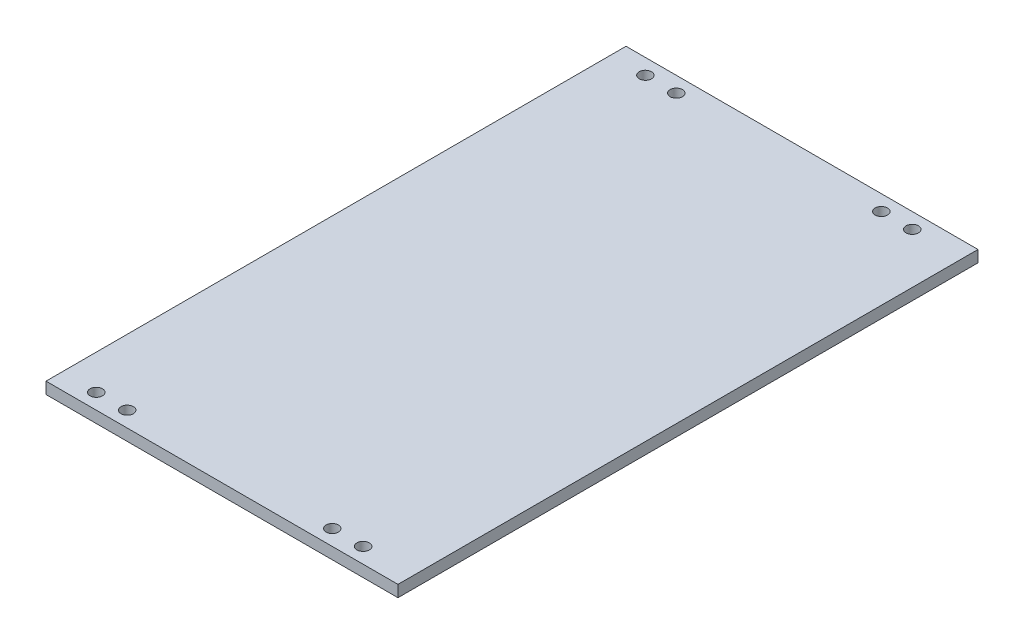
ISO-10303-21;
HEADER;
FILE_DESCRIPTION(('STEP AP214'),'2;1');
FILE_NAME('part.step','',(''),(''),'','','');
FILE_SCHEMA(('AUTOMOTIVE_DESIGN { 1 0 10303 214 1 1 1 1 }'));
ENDSEC;
DATA;
#1=APPLICATION_CONTEXT('core data for automotive mechanical design processes');
#2=APPLICATION_PROTOCOL_DEFINITION('international standard','automotive_design',2000,#1);
#3=PRODUCT_CONTEXT('',#1,'mechanical');
#4=PRODUCT('Part','Part','',(#3));
#5=PRODUCT_RELATED_PRODUCT_CATEGORY('part','',(#4));
#6=PRODUCT_DEFINITION_FORMATION('','',#4);
#7=PRODUCT_DEFINITION_CONTEXT('part definition',#1,'design');
#8=PRODUCT_DEFINITION('design','',#6,#7);
#9=PRODUCT_DEFINITION_SHAPE('','',#8);
#10=(LENGTH_UNIT() NAMED_UNIT(*) SI_UNIT(.MILLI.,.METRE.));
#11=(NAMED_UNIT(*) PLANE_ANGLE_UNIT() SI_UNIT($,.RADIAN.));
#12=(NAMED_UNIT(*) SI_UNIT($,.STERADIAN.) SOLID_ANGLE_UNIT());
#13=UNCERTAINTY_MEASURE_WITH_UNIT(LENGTH_MEASURE(1.E-05),#10,'distance_accuracy_value','');
#14=(GEOMETRIC_REPRESENTATION_CONTEXT(3) GLOBAL_UNCERTAINTY_ASSIGNED_CONTEXT((#13)) GLOBAL_UNIT_ASSIGNED_CONTEXT((#10,
#11,#12)) REPRESENTATION_CONTEXT('',''));
#15=CARTESIAN_POINT('',(0.,0.,0.));
#16=DIRECTION('',(0.,0.,1.));
#17=DIRECTION('',(1.,0.,0.));
#18=AXIS2_PLACEMENT_3D('',#15,#16,#17);
#19=CARTESIAN_POINT('',(65.2049606735181,5.25915524788277,-47.1117165948132));
#20=DIRECTION('',(1.,0.,0.));
#21=DIRECTION('',(0.,0.,-1.));
#22=AXIS2_PLACEMENT_3D('',#19,#20,#21);
#23=PLANE('',#22);
#24=DIRECTION('',(0.,0.,1.));
#25=VECTOR('',#24,1.);
#26=CARTESIAN_POINT('',(65.2049606735181,2.25915524788277,-47.1117165948132));
#27=LINE('',#26,#25);
#28=CARTESIAN_POINT('',(65.2049606735181,2.25915524788277,-47.1117165948132));
#29=VERTEX_POINT('',#28);
#30=CARTESIAN_POINT('',(65.2049606735181,2.25915524788277,102.888283405187));
#31=VERTEX_POINT('',#30);
#32=EDGE_CURVE('E119',#29,#31,#27,.T.);
#33=ORIENTED_EDGE('',*,*,#32,.F.);
#34=DIRECTION('',(0.,-1.,0.));
#35=VECTOR('',#34,1.);
#36=CARTESIAN_POINT('',(65.2049606735181,5.25915524788277,-47.1117165948132));
#37=LINE('',#36,#35);
#38=CARTESIAN_POINT('',(65.2049606735181,5.25915524788277,-47.1117165948132));
#39=VERTEX_POINT('',#38);
#40=EDGE_CURVE('E11',#39,#29,#37,.T.);
#41=ORIENTED_EDGE('',*,*,#40,.F.);
#42=DIRECTION('',(0.,0.,1.));
#43=VECTOR('',#42,1.);
#44=CARTESIAN_POINT('',(65.2049606735181,5.25915524788277,-47.1117165948132));
#45=LINE('',#44,#43);
#46=CARTESIAN_POINT('',(65.2049606735181,5.25915524788277,102.888283405187));
#47=VERTEX_POINT('',#46);
#48=EDGE_CURVE('E109',#39,#47,#45,.T.);
#49=ORIENTED_EDGE('',*,*,#48,.T.);
#50=DIRECTION('',(0.,-1.,0.));
#51=VECTOR('',#50,1.);
#52=CARTESIAN_POINT('',(65.2049606735181,5.25915524788277,102.888283405187));
#53=LINE('',#52,#51);
#54=EDGE_CURVE('E50',#47,#31,#53,.T.);
#55=ORIENTED_EDGE('',*,*,#54,.T.);
#56=EDGE_LOOP('',(#33,#41,#49,#55));
#57=FACE_BOUND('',#56,.T.);
#58=ADVANCED_FACE('F47',(#57),#23,.T.);
#59=CARTESIAN_POINT('',(65.2049606735181,5.25915524788277,-47.1117165948132));
#60=DIRECTION('',(0.,0.,-1.));
#61=DIRECTION('',(-1.,0.,0.));
#62=AXIS2_PLACEMENT_3D('',#59,#60,#61);
#63=PLANE('',#62);
#64=DIRECTION('',(1.,0.,0.));
#65=VECTOR('',#64,1.);
#66=CARTESIAN_POINT('',(65.2049606735181,2.25915524788277,-47.1117165948132));
#67=LINE('',#66,#65);
#68=CARTESIAN_POINT('',(-25.8155102632688,2.25915524788277,-47.1117165948132));
#69=VERTEX_POINT('',#68);
#70=EDGE_CURVE('E113',#69,#29,#67,.T.);
#71=ORIENTED_EDGE('',*,*,#70,.F.);
#72=DIRECTION('',(0.,-1.,0.));
#73=VECTOR('',#72,1.);
#74=CARTESIAN_POINT('',(-25.8155102632688,5.25915524788277,-47.1117165948132));
#75=LINE('',#74,#73);
#76=CARTESIAN_POINT('',(-25.8155102632688,5.25915524788277,-47.1117165948132));
#77=VERTEX_POINT('',#76);
#78=EDGE_CURVE('E57',#77,#69,#75,.T.);
#79=ORIENTED_EDGE('',*,*,#78,.F.);
#80=DIRECTION('',(1.,0.,0.));
#81=VECTOR('',#80,1.);
#82=CARTESIAN_POINT('',(65.2049606735181,5.25915524788277,-47.1117165948132));
#83=LINE('',#82,#81);
#84=EDGE_CURVE('E104',#77,#39,#83,.T.);
#85=ORIENTED_EDGE('',*,*,#84,.T.);
#86=ORIENTED_EDGE('',*,*,#40,.T.);
#87=EDGE_LOOP('',(#71,#79,#85,#86));
#88=FACE_BOUND('',#87,.T.);
#89=ADVANCED_FACE('F142',(#88),#63,.T.);
#90=CARTESIAN_POINT('',(-25.8155102632688,5.25915524788277,-47.1117165948132));
#91=DIRECTION('',(-1.,0.,0.));
#92=DIRECTION('',(0.,0.,1.));
#93=AXIS2_PLACEMENT_3D('',#90,#91,#92);
#94=PLANE('',#93);
#95=DIRECTION('',(0.,0.,-1.));
#96=VECTOR('',#95,1.);
#97=CARTESIAN_POINT('',(-25.8155102632688,2.25915524788277,-47.1117165948132));
#98=LINE('',#97,#96);
#99=CARTESIAN_POINT('',(-25.8155102632689,2.25915524788277,102.888283405187));
#100=VERTEX_POINT('',#99);
#101=EDGE_CURVE('E98',#100,#69,#98,.T.);
#102=ORIENTED_EDGE('',*,*,#101,.F.);
#103=DIRECTION('',(0.,-1.,0.));
#104=VECTOR('',#103,1.);
#105=CARTESIAN_POINT('',(-25.8155102632689,5.25915524788277,102.888283405187));
#106=LINE('',#105,#104);
#107=CARTESIAN_POINT('',(-25.8155102632689,5.25915524788277,102.888283405187));
#108=VERTEX_POINT('',#107);
#109=EDGE_CURVE('E93',#108,#100,#106,.T.);
#110=ORIENTED_EDGE('',*,*,#109,.F.);
#111=DIRECTION('',(0.,0.,-1.));
#112=VECTOR('',#111,1.);
#113=CARTESIAN_POINT('',(-25.8155102632688,5.25915524788277,-47.1117165948132));
#114=LINE('',#113,#112);
#115=EDGE_CURVE('E96',#108,#77,#114,.T.);
#116=ORIENTED_EDGE('',*,*,#115,.T.);
#117=ORIENTED_EDGE('',*,*,#78,.T.);
#118=EDGE_LOOP('',(#102,#110,#116,#117));
#119=FACE_BOUND('',#118,.T.);
#120=ADVANCED_FACE('F95',(#119),#94,.T.);
#121=CARTESIAN_POINT('',(65.2049606735181,5.25915524788277,102.888283405187));
#122=DIRECTION('',(0.,0.,1.));
#123=DIRECTION('',(1.,0.,0.));
#124=AXIS2_PLACEMENT_3D('',#121,#122,#123);
#125=PLANE('',#124);
#126=DIRECTION('',(-1.,0.,0.));
#127=VECTOR('',#126,1.);
#128=CARTESIAN_POINT('',(65.2049606735181,2.25915524788277,102.888283405187));
#129=LINE('',#128,#127);
#130=EDGE_CURVE('E123',#31,#100,#129,.T.);
#131=ORIENTED_EDGE('',*,*,#130,.F.);
#132=ORIENTED_EDGE('',*,*,#54,.F.);
#133=DIRECTION('',(-1.,0.,0.));
#134=VECTOR('',#133,1.);
#135=CARTESIAN_POINT('',(65.2049606735181,5.25915524788277,102.888283405187));
#136=LINE('',#135,#134);
#137=EDGE_CURVE('E103',#47,#108,#136,.T.);
#138=ORIENTED_EDGE('',*,*,#137,.T.);
#139=ORIENTED_EDGE('',*,*,#109,.T.);
#140=EDGE_LOOP('',(#131,#132,#138,#139));
#141=FACE_BOUND('',#140,.T.);
#142=ADVANCED_FACE('F107',(#141),#125,.T.);
#143=CARTESIAN_POINT('',(0.,5.25915524788277,0.));
#144=DIRECTION('',(0.,-1.,0.));
#145=DIRECTION('',(0.,0.,-1.));
#146=AXIS2_PLACEMENT_3D('',#143,#144,#145);
#147=PLANE('',#146);
#148=CARTESIAN_POINT('',(-16.8155102632688,5.25915524788277,98.8882834051867));
#149=DIRECTION('',(0.,-1.,0.));
#150=DIRECTION('',(0.,0.,1.));
#151=AXIS2_PLACEMENT_3D('',#148,#149,#150);
#152=CIRCLE('',#151,1.59999999999999);
#153=CARTESIAN_POINT('',(-16.8155102632688,5.25915524788277,100.488283405187));
#154=VERTEX_POINT('',#153);
#155=EDGE_CURVE('E199',#154,#154,#152,.T.);
#156=ORIENTED_EDGE('',*,*,#155,.T.);
#157=EDGE_LOOP('',(#156));
#158=FACE_BOUND('',#157,.T.);
#159=CARTESIAN_POINT('',(-8.81551026326879,5.25915524788277,98.8882834051867));
#160=DIRECTION('',(0.,-1.,0.));
#161=DIRECTION('',(0.,0.,1.));
#162=AXIS2_PLACEMENT_3D('',#159,#160,#161);
#163=CIRCLE('',#162,1.59999999999999);
#164=CARTESIAN_POINT('',(-8.81551026326879,5.25915524788277,100.488283405187));
#165=VERTEX_POINT('',#164);
#166=EDGE_CURVE('E210',#165,#165,#163,.T.);
#167=ORIENTED_EDGE('',*,*,#166,.T.);
#168=EDGE_LOOP('',(#167));
#169=FACE_BOUND('',#168,.T.);
#170=CARTESIAN_POINT('',(-8.81551026326885,5.25915524788277,-43.1117165948132));
#171=DIRECTION('',(0.,-1.,0.));
#172=DIRECTION('',(0.,0.,-1.));
#173=AXIS2_PLACEMENT_3D('',#170,#171,#172);
#174=CIRCLE('',#173,1.6);
#175=CARTESIAN_POINT('',(-8.81551026326885,5.25915524788277,-44.7117165948132));
#176=VERTEX_POINT('',#175);
#177=EDGE_CURVE('E218',#176,#176,#174,.T.);
#178=ORIENTED_EDGE('',*,*,#177,.T.);
#179=EDGE_LOOP('',(#178));
#180=FACE_BOUND('',#179,.T.);
#181=CARTESIAN_POINT('',(-16.8155102632688,5.25915524788277,-43.1117165948132));
#182=DIRECTION('',(0.,-1.,0.));
#183=DIRECTION('',(0.,0.,-1.));
#184=AXIS2_PLACEMENT_3D('',#181,#182,#183);
#185=CIRCLE('',#184,1.6);
#186=CARTESIAN_POINT('',(-16.8155102632688,5.25915524788277,-44.7117165948132));
#187=VERTEX_POINT('',#186);
#188=EDGE_CURVE('E226',#187,#187,#185,.T.);
#189=ORIENTED_EDGE('',*,*,#188,.T.);
#190=EDGE_LOOP('',(#189));
#191=FACE_BOUND('',#190,.T.);
#192=CARTESIAN_POINT('',(44.2049606735182,5.25915524788277,98.8882834051868));
#193=DIRECTION('',(0.,-1.,0.));
#194=DIRECTION('',(0.,0.,1.));
#195=AXIS2_PLACEMENT_3D('',#192,#193,#194);
#196=CIRCLE('',#195,1.60000000000001);
#197=CARTESIAN_POINT('',(44.2049606735182,5.25915524788277,100.488283405187));
#198=VERTEX_POINT('',#197);
#199=EDGE_CURVE('E234',#198,#198,#196,.T.);
#200=ORIENTED_EDGE('',*,*,#199,.T.);
#201=EDGE_LOOP('',(#200));
#202=FACE_BOUND('',#201,.T.);
#203=CARTESIAN_POINT('',(52.2049606735181,5.25915524788277,98.8882834051868));
#204=DIRECTION('',(0.,-1.,0.));
#205=DIRECTION('',(0.,0.,1.));
#206=AXIS2_PLACEMENT_3D('',#203,#204,#205);
#207=CIRCLE('',#206,1.60000000000001);
#208=CARTESIAN_POINT('',(52.2049606735181,5.25915524788277,100.488283405187));
#209=VERTEX_POINT('',#208);
#210=EDGE_CURVE('E242',#209,#209,#207,.T.);
#211=ORIENTED_EDGE('',*,*,#210,.T.);
#212=EDGE_LOOP('',(#211));
#213=FACE_BOUND('',#212,.T.);
#214=CARTESIAN_POINT('',(52.2049606735181,5.25915524788277,-43.1117165948132));
#215=DIRECTION('',(0.,-1.,0.));
#216=DIRECTION('',(0.,0.,-1.));
#217=AXIS2_PLACEMENT_3D('',#214,#215,#216);
#218=CIRCLE('',#217,1.60000000000001);
#219=CARTESIAN_POINT('',(52.2049606735181,5.25915524788277,-44.7117165948132));
#220=VERTEX_POINT('',#219);
#221=EDGE_CURVE('E250',#220,#220,#218,.T.);
#222=ORIENTED_EDGE('',*,*,#221,.T.);
#223=EDGE_LOOP('',(#222));
#224=FACE_BOUND('',#223,.T.);
#225=CARTESIAN_POINT('',(44.2049606735181,5.25915524788277,-43.1117165948132));
#226=DIRECTION('',(0.,-1.,0.));
#227=DIRECTION('',(0.,0.,-1.));
#228=AXIS2_PLACEMENT_3D('',#225,#226,#227);
#229=CIRCLE('',#228,1.60000000000001);
#230=CARTESIAN_POINT('',(44.2049606735181,5.25915524788277,-44.7117165948132));
#231=VERTEX_POINT('',#230);
#232=EDGE_CURVE('E124',#231,#231,#229,.T.);
#233=ORIENTED_EDGE('',*,*,#232,.T.);
#234=EDGE_LOOP('',(#233));
#235=FACE_BOUND('',#234,.T.);
#236=ORIENTED_EDGE('',*,*,#48,.F.);
#237=ORIENTED_EDGE('',*,*,#84,.F.);
#238=ORIENTED_EDGE('',*,*,#115,.F.);
#239=ORIENTED_EDGE('',*,*,#137,.F.);
#240=EDGE_LOOP('',(#236,#237,#238,#239));
#241=FACE_BOUND('',#240,.T.);
#242=ADVANCED_FACE('F102',(#158,#169,#180,#191,#202,#213,#224,#235,#241),#147,.F.);
#243=CARTESIAN_POINT('',(0.,2.25915524788277,0.));
#244=DIRECTION('',(0.,-1.,0.));
#245=DIRECTION('',(0.,0.,-1.));
#246=AXIS2_PLACEMENT_3D('',#243,#244,#245);
#247=PLANE('',#246);
#248=CARTESIAN_POINT('',(-16.8155102632688,2.25915524788277,98.8882834051867));
#249=DIRECTION('',(0.,-1.,0.));
#250=DIRECTION('',(0.,0.,1.));
#251=AXIS2_PLACEMENT_3D('',#248,#249,#250);
#252=CIRCLE('',#251,1.59999999999999);
#253=CARTESIAN_POINT('',(-16.8155102632688,2.25915524788277,100.488283405187));
#254=VERTEX_POINT('',#253);
#255=EDGE_CURVE('E202',#254,#254,#252,.T.);
#256=ORIENTED_EDGE('',*,*,#255,.F.);
#257=EDGE_LOOP('',(#256));
#258=FACE_BOUND('',#257,.T.);
#259=CARTESIAN_POINT('',(-8.81551026326879,2.25915524788277,98.8882834051867));
#260=DIRECTION('',(0.,-1.,0.));
#261=DIRECTION('',(0.,0.,1.));
#262=AXIS2_PLACEMENT_3D('',#259,#260,#261);
#263=CIRCLE('',#262,1.59999999999999);
#264=CARTESIAN_POINT('',(-8.81551026326879,2.25915524788277,100.488283405187));
#265=VERTEX_POINT('',#264);
#266=EDGE_CURVE('E207',#265,#265,#263,.T.);
#267=ORIENTED_EDGE('',*,*,#266,.F.);
#268=EDGE_LOOP('',(#267));
#269=FACE_BOUND('',#268,.T.);
#270=CARTESIAN_POINT('',(-8.81551026326885,2.25915524788277,-43.1117165948132));
#271=DIRECTION('',(0.,-1.,0.));
#272=DIRECTION('',(0.,0.,-1.));
#273=AXIS2_PLACEMENT_3D('',#270,#271,#272);
#274=CIRCLE('',#273,1.6);
#275=CARTESIAN_POINT('',(-8.81551026326885,2.25915524788277,-44.7117165948132));
#276=VERTEX_POINT('',#275);
#277=EDGE_CURVE('E214',#276,#276,#274,.T.);
#278=ORIENTED_EDGE('',*,*,#277,.F.);
#279=EDGE_LOOP('',(#278));
#280=FACE_BOUND('',#279,.T.);
#281=CARTESIAN_POINT('',(-16.8155102632688,2.25915524788277,-43.1117165948132));
#282=DIRECTION('',(0.,-1.,0.));
#283=DIRECTION('',(0.,0.,-1.));
#284=AXIS2_PLACEMENT_3D('',#281,#282,#283);
#285=CIRCLE('',#284,1.6);
#286=CARTESIAN_POINT('',(-16.8155102632688,2.25915524788277,-44.7117165948132));
#287=VERTEX_POINT('',#286);
#288=EDGE_CURVE('E222',#287,#287,#285,.T.);
#289=ORIENTED_EDGE('',*,*,#288,.F.);
#290=EDGE_LOOP('',(#289));
#291=FACE_BOUND('',#290,.T.);
#292=CARTESIAN_POINT('',(44.2049606735182,2.25915524788277,98.8882834051868));
#293=DIRECTION('',(0.,-1.,0.));
#294=DIRECTION('',(0.,0.,1.));
#295=AXIS2_PLACEMENT_3D('',#292,#293,#294);
#296=CIRCLE('',#295,1.60000000000001);
#297=CARTESIAN_POINT('',(44.2049606735182,2.25915524788277,100.488283405187));
#298=VERTEX_POINT('',#297);
#299=EDGE_CURVE('E230',#298,#298,#296,.T.);
#300=ORIENTED_EDGE('',*,*,#299,.F.);
#301=EDGE_LOOP('',(#300));
#302=FACE_BOUND('',#301,.T.);
#303=CARTESIAN_POINT('',(52.2049606735181,2.25915524788277,98.8882834051868));
#304=DIRECTION('',(0.,-1.,0.));
#305=DIRECTION('',(0.,0.,1.));
#306=AXIS2_PLACEMENT_3D('',#303,#304,#305);
#307=CIRCLE('',#306,1.60000000000001);
#308=CARTESIAN_POINT('',(52.2049606735181,2.25915524788277,100.488283405187));
#309=VERTEX_POINT('',#308);
#310=EDGE_CURVE('E238',#309,#309,#307,.T.);
#311=ORIENTED_EDGE('',*,*,#310,.F.);
#312=EDGE_LOOP('',(#311));
#313=FACE_BOUND('',#312,.T.);
#314=CARTESIAN_POINT('',(52.2049606735181,2.25915524788277,-43.1117165948132));
#315=DIRECTION('',(0.,-1.,0.));
#316=DIRECTION('',(0.,0.,-1.));
#317=AXIS2_PLACEMENT_3D('',#314,#315,#316);
#318=CIRCLE('',#317,1.60000000000001);
#319=CARTESIAN_POINT('',(52.2049606735181,2.25915524788277,-44.7117165948132));
#320=VERTEX_POINT('',#319);
#321=EDGE_CURVE('E246',#320,#320,#318,.T.);
#322=ORIENTED_EDGE('',*,*,#321,.F.);
#323=EDGE_LOOP('',(#322));
#324=FACE_BOUND('',#323,.T.);
#325=CARTESIAN_POINT('',(44.2049606735181,2.25915524788277,-43.1117165948132));
#326=DIRECTION('',(0.,-1.,0.));
#327=DIRECTION('',(0.,0.,-1.));
#328=AXIS2_PLACEMENT_3D('',#325,#326,#327);
#329=CIRCLE('',#328,1.60000000000001);
#330=CARTESIAN_POINT('',(44.2049606735181,2.25915524788277,-44.7117165948132));
#331=VERTEX_POINT('',#330);
#332=EDGE_CURVE('E254',#331,#331,#329,.T.);
#333=ORIENTED_EDGE('',*,*,#332,.F.);
#334=EDGE_LOOP('',(#333));
#335=FACE_BOUND('',#334,.T.);
#336=ORIENTED_EDGE('',*,*,#32,.T.);
#337=ORIENTED_EDGE('',*,*,#130,.T.);
#338=ORIENTED_EDGE('',*,*,#101,.T.);
#339=ORIENTED_EDGE('',*,*,#70,.T.);
#340=EDGE_LOOP('',(#336,#337,#338,#339));
#341=FACE_BOUND('',#340,.T.);
#342=ADVANCED_FACE('F141',(#258,#269,#280,#291,#302,#313,#324,#335,#341),#247,.T.);
#343=CARTESIAN_POINT('',(44.2049606735181,5.25915524788277,-43.1117165948132));
#344=DIRECTION('',(0.,-1.,0.));
#345=DIRECTION('',(0.,0.,-1.));
#346=AXIS2_PLACEMENT_3D('',#343,#344,#345);
#347=CYLINDRICAL_SURFACE('',#346,1.60000000000001);
#348=ORIENTED_EDGE('',*,*,#232,.F.);
#349=EDGE_LOOP('',(#348));
#350=FACE_BOUND('',#349,.T.);
#351=ORIENTED_EDGE('',*,*,#332,.T.);
#352=EDGE_LOOP('',(#351));
#353=FACE_BOUND('',#352,.T.);
#354=ADVANCED_FACE('F160',(#350,#353),#347,.F.);
#355=CARTESIAN_POINT('',(52.2049606735181,5.25915524788277,-43.1117165948132));
#356=DIRECTION('',(0.,-1.,0.));
#357=DIRECTION('',(0.,0.,-1.));
#358=AXIS2_PLACEMENT_3D('',#355,#356,#357);
#359=CYLINDRICAL_SURFACE('',#358,1.60000000000001);
#360=ORIENTED_EDGE('',*,*,#221,.F.);
#361=EDGE_LOOP('',(#360));
#362=FACE_BOUND('',#361,.T.);
#363=ORIENTED_EDGE('',*,*,#321,.T.);
#364=EDGE_LOOP('',(#363));
#365=FACE_BOUND('',#364,.T.);
#366=ADVANCED_FACE('F167',(#362,#365),#359,.F.);
#367=CARTESIAN_POINT('',(52.2049606735181,5.25915524788277,98.8882834051868));
#368=DIRECTION('',(0.,-1.,0.));
#369=DIRECTION('',(0.,0.,-1.));
#370=AXIS2_PLACEMENT_3D('',#367,#368,#369);
#371=CYLINDRICAL_SURFACE('',#370,1.60000000000001);
#372=ORIENTED_EDGE('',*,*,#210,.F.);
#373=EDGE_LOOP('',(#372));
#374=FACE_BOUND('',#373,.T.);
#375=ORIENTED_EDGE('',*,*,#310,.T.);
#376=EDGE_LOOP('',(#375));
#377=FACE_BOUND('',#376,.T.);
#378=ADVANCED_FACE('F171',(#374,#377),#371,.F.);
#379=CARTESIAN_POINT('',(44.2049606735182,5.25915524788277,98.8882834051868));
#380=DIRECTION('',(0.,-1.,0.));
#381=DIRECTION('',(0.,0.,-1.));
#382=AXIS2_PLACEMENT_3D('',#379,#380,#381);
#383=CYLINDRICAL_SURFACE('',#382,1.60000000000001);
#384=ORIENTED_EDGE('',*,*,#199,.F.);
#385=EDGE_LOOP('',(#384));
#386=FACE_BOUND('',#385,.T.);
#387=ORIENTED_EDGE('',*,*,#299,.T.);
#388=EDGE_LOOP('',(#387));
#389=FACE_BOUND('',#388,.T.);
#390=ADVANCED_FACE('F175',(#386,#389),#383,.F.);
#391=CARTESIAN_POINT('',(-16.8155102632688,5.25915524788277,-43.1117165948132));
#392=DIRECTION('',(0.,-1.,0.));
#393=DIRECTION('',(0.,0.,-1.));
#394=AXIS2_PLACEMENT_3D('',#391,#392,#393);
#395=CYLINDRICAL_SURFACE('',#394,1.6);
#396=ORIENTED_EDGE('',*,*,#188,.F.);
#397=EDGE_LOOP('',(#396));
#398=FACE_BOUND('',#397,.T.);
#399=ORIENTED_EDGE('',*,*,#288,.T.);
#400=EDGE_LOOP('',(#399));
#401=FACE_BOUND('',#400,.T.);
#402=ADVANCED_FACE('F179',(#398,#401),#395,.F.);
#403=CARTESIAN_POINT('',(-8.81551026326885,5.25915524788277,-43.1117165948132));
#404=DIRECTION('',(0.,-1.,0.));
#405=DIRECTION('',(0.,0.,-1.));
#406=AXIS2_PLACEMENT_3D('',#403,#404,#405);
#407=CYLINDRICAL_SURFACE('',#406,1.6);
#408=ORIENTED_EDGE('',*,*,#177,.F.);
#409=EDGE_LOOP('',(#408));
#410=FACE_BOUND('',#409,.T.);
#411=ORIENTED_EDGE('',*,*,#277,.T.);
#412=EDGE_LOOP('',(#411));
#413=FACE_BOUND('',#412,.T.);
#414=ADVANCED_FACE('F183',(#410,#413),#407,.F.);
#415=CARTESIAN_POINT('',(-8.81551026326879,5.25915524788277,98.8882834051867));
#416=DIRECTION('',(0.,-1.,0.));
#417=DIRECTION('',(0.,0.,-1.));
#418=AXIS2_PLACEMENT_3D('',#415,#416,#417);
#419=CYLINDRICAL_SURFACE('',#418,1.59999999999999);
#420=ORIENTED_EDGE('',*,*,#166,.F.);
#421=EDGE_LOOP('',(#420));
#422=FACE_BOUND('',#421,.T.);
#423=ORIENTED_EDGE('',*,*,#266,.T.);
#424=EDGE_LOOP('',(#423));
#425=FACE_BOUND('',#424,.T.);
#426=ADVANCED_FACE('F187',(#422,#425),#419,.F.);
#427=CARTESIAN_POINT('',(-16.8155102632688,5.25915524788277,98.8882834051867));
#428=DIRECTION('',(0.,-1.,0.));
#429=DIRECTION('',(0.,0.,-1.));
#430=AXIS2_PLACEMENT_3D('',#427,#428,#429);
#431=CYLINDRICAL_SURFACE('',#430,1.59999999999999);
#432=ORIENTED_EDGE('',*,*,#155,.F.);
#433=EDGE_LOOP('',(#432));
#434=FACE_BOUND('',#433,.T.);
#435=ORIENTED_EDGE('',*,*,#255,.T.);
#436=EDGE_LOOP('',(#435));
#437=FACE_BOUND('',#436,.T.);
#438=ADVANCED_FACE('F191',(#434,#437),#431,.F.);
#439=CLOSED_SHELL('',(#58,#89,#120,#142,#242,#342,#354,#366,#378,#390,#402,#414,#426,#438));
#440=MANIFOLD_SOLID_BREP('B2',#439);
#441=ADVANCED_BREP_SHAPE_REPRESENTATION('',(#18,#440),#14);
#442=SHAPE_DEFINITION_REPRESENTATION(#9,#441);
ENDSEC;
END-ISO-10303-21;
